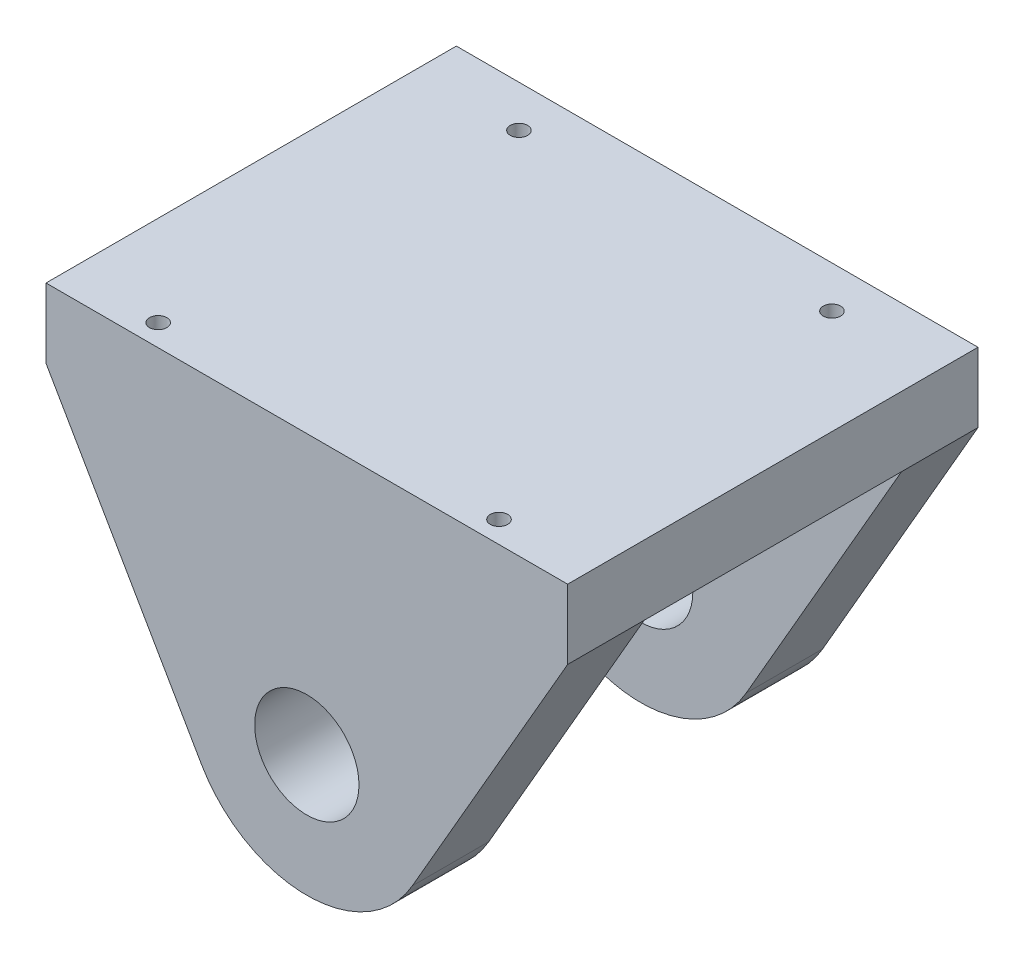
ISO-10303-21;
HEADER;
FILE_DESCRIPTION(('STEP AP214'),'2;1');
FILE_NAME('part.step','',(''),(''),'','','');
FILE_SCHEMA(('AUTOMOTIVE_DESIGN { 1 0 10303 214 1 1 1 1 }'));
ENDSEC;
DATA;
#1=APPLICATION_CONTEXT('core data for automotive mechanical design processes');
#2=APPLICATION_PROTOCOL_DEFINITION('international standard','automotive_design',2000,#1);
#3=PRODUCT_CONTEXT('',#1,'mechanical');
#4=PRODUCT('Part','Part','',(#3));
#5=PRODUCT_RELATED_PRODUCT_CATEGORY('part','',(#4));
#6=PRODUCT_DEFINITION_FORMATION('','',#4);
#7=PRODUCT_DEFINITION_CONTEXT('part definition',#1,'design');
#8=PRODUCT_DEFINITION('design','',#6,#7);
#9=PRODUCT_DEFINITION_SHAPE('','',#8);
#10=(LENGTH_UNIT() NAMED_UNIT(*) SI_UNIT(.MILLI.,.METRE.));
#11=(NAMED_UNIT(*) PLANE_ANGLE_UNIT() SI_UNIT($,.RADIAN.));
#12=(NAMED_UNIT(*) SI_UNIT($,.STERADIAN.) SOLID_ANGLE_UNIT());
#13=UNCERTAINTY_MEASURE_WITH_UNIT(LENGTH_MEASURE(1.E-05),#10,'distance_accuracy_value','');
#14=(GEOMETRIC_REPRESENTATION_CONTEXT(3) GLOBAL_UNCERTAINTY_ASSIGNED_CONTEXT((#13)) GLOBAL_UNIT_ASSIGNED_CONTEXT((#10,
#11,#12)) REPRESENTATION_CONTEXT('',''));
#15=CARTESIAN_POINT('',(0.,0.,0.));
#16=DIRECTION('',(0.,0.,1.));
#17=DIRECTION('',(1.,0.,0.));
#18=AXIS2_PLACEMENT_3D('',#15,#16,#17);
#19=CARTESIAN_POINT('',(0.,30.,-59.));
#20=DIRECTION('',(0.,-1.,0.));
#21=DIRECTION('',(0.,0.,-1.));
#22=AXIS2_PLACEMENT_3D('',#19,#20,#21);
#23=PLANE('',#22);
#24=DIRECTION('',(0.,0.,1.));
#25=VECTOR('',#24,1.);
#26=CARTESIAN_POINT('',(-37.5,30.,-59.));
#27=LINE('',#26,#25);
#28=CARTESIAN_POINT('',(-37.5,30.,-48.));
#29=VERTEX_POINT('',#28);
#30=CARTESIAN_POINT('',(-37.5,30.,-11.));
#31=VERTEX_POINT('',#30);
#32=EDGE_CURVE('E71',#29,#31,#27,.T.);
#33=ORIENTED_EDGE('',*,*,#32,.F.);
#34=DIRECTION('',(1.,0.,0.));
#35=VECTOR('',#34,1.);
#36=CARTESIAN_POINT('',(0.,30.,-48.));
#37=LINE('',#36,#35);
#38=CARTESIAN_POINT('',(37.5,30.,-48.));
#39=VERTEX_POINT('',#38);
#40=EDGE_CURVE('E66',#29,#39,#37,.T.);
#41=ORIENTED_EDGE('',*,*,#40,.T.);
#42=DIRECTION('',(0.,0.,1.));
#43=VECTOR('',#42,1.);
#44=CARTESIAN_POINT('',(37.5,30.,-59.));
#45=LINE('',#44,#43);
#46=CARTESIAN_POINT('',(37.5,30.,-11.));
#47=VERTEX_POINT('',#46);
#48=EDGE_CURVE('E241',#39,#47,#45,.T.);
#49=ORIENTED_EDGE('',*,*,#48,.T.);
#50=DIRECTION('',(1.,0.,0.));
#51=VECTOR('',#50,1.);
#52=CARTESIAN_POINT('',(0.,30.,-11.));
#53=LINE('',#52,#51);
#54=EDGE_CURVE('E265',#31,#47,#53,.T.);
#55=ORIENTED_EDGE('',*,*,#54,.F.);
#56=EDGE_LOOP('',(#33,#41,#49,#55));
#57=FACE_BOUND('',#56,.T.);
#58=ADVANCED_FACE('F48',(#57),#23,.T.);
#59=CARTESIAN_POINT('',(-15.1601468894299,-8.74185027845409,-11.));
#60=DIRECTION('',(0.866294107967425,0.499534301625948,0.));
#61=DIRECTION('',(-0.499534301625948,0.866294107967425,0.));
#62=AXIS2_PLACEMENT_3D('',#59,#60,#61);
#63=PLANE('',#62);
#64=DIRECTION('',(-0.499534301625948,0.866294107967425,0.));
#65=VECTOR('',#64,1.);
#66=CARTESIAN_POINT('',(-15.1601468894299,-8.74185027845409,0.));
#67=LINE('',#66,#65);
#68=CARTESIAN_POINT('',(-15.1601468894299,-8.74185027845409,0.));
#69=VERTEX_POINT('',#68);
#70=CARTESIAN_POINT('',(-37.5,30.,0.));
#71=VERTEX_POINT('',#70);
#72=EDGE_CURVE('E240',#69,#71,#67,.T.);
#73=ORIENTED_EDGE('',*,*,#72,.T.);
#74=DIRECTION('',(0.,0.,1.));
#75=VECTOR('',#74,1.);
#76=CARTESIAN_POINT('',(-37.5,30.,-11.));
#77=LINE('',#76,#75);
#78=EDGE_CURVE('E11',#31,#71,#77,.T.);
#79=ORIENTED_EDGE('',*,*,#78,.F.);
#80=DIRECTION('',(-0.499534301625948,0.866294107967425,0.));
#81=VECTOR('',#80,1.);
#82=CARTESIAN_POINT('',(-15.1601468894299,-8.74185027845409,-11.));
#83=LINE('',#82,#81);
#84=CARTESIAN_POINT('',(-15.1601468894299,-8.74185027845409,-11.));
#85=VERTEX_POINT('',#84);
#86=EDGE_CURVE('E252',#85,#31,#83,.T.);
#87=ORIENTED_EDGE('',*,*,#86,.F.);
#88=DIRECTION('',(0.,0.,1.));
#89=VECTOR('',#88,1.);
#90=CARTESIAN_POINT('',(-15.1601468894299,-8.74185027845409,-11.));
#91=LINE('',#90,#89);
#92=EDGE_CURVE('E52',#85,#69,#91,.T.);
#93=ORIENTED_EDGE('',*,*,#92,.T.);
#94=EDGE_LOOP('',(#73,#79,#87,#93));
#95=FACE_BOUND('',#94,.T.);
#96=ADVANCED_FACE('F50',(#95),#63,.F.);
#97=CARTESIAN_POINT('',(15.1601468894299,-8.74185027845409,-11.));
#98=DIRECTION('',(0.866294107967425,-0.499534301625948,0.));
#99=DIRECTION('',(0.499534301625948,0.866294107967425,0.));
#100=AXIS2_PLACEMENT_3D('',#97,#98,#99);
#101=PLANE('',#100);
#102=DIRECTION('',(0.499534301625948,0.866294107967425,0.));
#103=VECTOR('',#102,1.);
#104=CARTESIAN_POINT('',(15.1601468894299,-8.74185027845409,0.));
#105=LINE('',#104,#103);
#106=CARTESIAN_POINT('',(15.1601468894299,-8.74185027845409,0.));
#107=VERTEX_POINT('',#106);
#108=CARTESIAN_POINT('',(37.5,30.,0.));
#109=VERTEX_POINT('',#108);
#110=EDGE_CURVE('E280',#107,#109,#105,.T.);
#111=ORIENTED_EDGE('',*,*,#110,.F.);
#112=DIRECTION('',(0.,0.,1.));
#113=VECTOR('',#112,1.);
#114=CARTESIAN_POINT('',(15.1601468894299,-8.74185027845409,-11.));
#115=LINE('',#114,#113);
#116=CARTESIAN_POINT('',(15.1601468894299,-8.74185027845409,-11.));
#117=VERTEX_POINT('',#116);
#118=EDGE_CURVE('E289',#117,#107,#115,.T.);
#119=ORIENTED_EDGE('',*,*,#118,.F.);
#120=DIRECTION('',(0.499534301625948,0.866294107967425,0.));
#121=VECTOR('',#120,1.);
#122=CARTESIAN_POINT('',(15.1601468894299,-8.74185027845409,-11.));
#123=LINE('',#122,#121);
#124=EDGE_CURVE('E261',#117,#47,#123,.T.);
#125=ORIENTED_EDGE('',*,*,#124,.T.);
#126=DIRECTION('',(0.,0.,1.));
#127=VECTOR('',#126,1.);
#128=CARTESIAN_POINT('',(37.5,30.,-11.));
#129=LINE('',#128,#127);
#130=EDGE_CURVE('E58',#47,#109,#129,.T.);
#131=ORIENTED_EDGE('',*,*,#130,.T.);
#132=EDGE_LOOP('',(#111,#119,#125,#131));
#133=FACE_BOUND('',#132,.T.);
#134=ADVANCED_FACE('F308',(#133),#101,.T.);
#135=CARTESIAN_POINT('',(0.,0.,-11.));
#136=DIRECTION('',(0.,0.,1.));
#137=DIRECTION('',(1.,0.,0.));
#138=AXIS2_PLACEMENT_3D('',#135,#136,#137);
#139=CYLINDRICAL_SURFACE('',#138,17.5);
#140=CARTESIAN_POINT('',(0.,0.,0.));
#141=DIRECTION('',(0.,0.,1.));
#142=DIRECTION('',(1.,0.,0.));
#143=AXIS2_PLACEMENT_3D('',#140,#141,#142);
#144=CIRCLE('',#143,17.5);
#145=EDGE_CURVE('E276',#69,#107,#144,.T.);
#146=ORIENTED_EDGE('',*,*,#145,.F.);
#147=ORIENTED_EDGE('',*,*,#92,.F.);
#148=CARTESIAN_POINT('',(0.,0.,-11.));
#149=DIRECTION('',(0.,0.,1.));
#150=DIRECTION('',(1.,0.,0.));
#151=AXIS2_PLACEMENT_3D('',#148,#149,#150);
#152=CIRCLE('',#151,17.5);
#153=EDGE_CURVE('E256',#85,#117,#152,.T.);
#154=ORIENTED_EDGE('',*,*,#153,.T.);
#155=ORIENTED_EDGE('',*,*,#118,.T.);
#156=EDGE_LOOP('',(#146,#147,#154,#155));
#157=FACE_BOUND('',#156,.T.);
#158=ADVANCED_FACE('F305',(#157),#139,.T.);
#159=CARTESIAN_POINT('',(0.,0.,-11.));
#160=DIRECTION('',(0.,0.,1.));
#161=DIRECTION('',(1.,0.,0.));
#162=AXIS2_PLACEMENT_3D('',#159,#160,#161);
#163=CYLINDRICAL_SURFACE('',#162,7.5);
#164=CARTESIAN_POINT('',(0.,0.,-11.));
#165=DIRECTION('',(0.,0.,1.));
#166=DIRECTION('',(1.,0.,0.));
#167=AXIS2_PLACEMENT_3D('',#164,#165,#166);
#168=CIRCLE('',#167,7.5);
#169=CARTESIAN_POINT('',(7.5,0.,-11.));
#170=VERTEX_POINT('',#169);
#171=EDGE_CURVE('E269',#170,#170,#168,.T.);
#172=ORIENTED_EDGE('',*,*,#171,.F.);
#173=EDGE_LOOP('',(#172));
#174=FACE_BOUND('',#173,.T.);
#175=CARTESIAN_POINT('',(0.,0.,0.));
#176=DIRECTION('',(0.,0.,1.));
#177=DIRECTION('',(1.,0.,0.));
#178=AXIS2_PLACEMENT_3D('',#175,#176,#177);
#179=CIRCLE('',#178,7.5);
#180=CARTESIAN_POINT('',(7.5,0.,0.));
#181=VERTEX_POINT('',#180);
#182=EDGE_CURVE('E257',#181,#181,#179,.T.);
#183=ORIENTED_EDGE('',*,*,#182,.T.);
#184=EDGE_LOOP('',(#183));
#185=FACE_BOUND('',#184,.T.);
#186=ADVANCED_FACE('F307',(#174,#185),#163,.F.);
#187=CARTESIAN_POINT('',(0.,0.,-11.));
#188=DIRECTION('',(0.,0.,1.));
#189=DIRECTION('',(1.,0.,0.));
#190=AXIS2_PLACEMENT_3D('',#187,#188,#189);
#191=PLANE('',#190);
#192=ORIENTED_EDGE('',*,*,#86,.T.);
#193=ORIENTED_EDGE('',*,*,#54,.T.);
#194=ORIENTED_EDGE('',*,*,#124,.F.);
#195=ORIENTED_EDGE('',*,*,#153,.F.);
#196=EDGE_LOOP('',(#192,#193,#194,#195));
#197=FACE_BOUND('',#196,.T.);
#198=ORIENTED_EDGE('',*,*,#171,.T.);
#199=EDGE_LOOP('',(#198));
#200=FACE_BOUND('',#199,.T.);
#201=ADVANCED_FACE('F312',(#197,#200),#191,.F.);
#202=CARTESIAN_POINT('',(0.,0.,0.));
#203=DIRECTION('',(0.,0.,1.));
#204=DIRECTION('',(1.,0.,0.));
#205=AXIS2_PLACEMENT_3D('',#202,#203,#204);
#206=PLANE('',#205);
#207=ORIENTED_EDGE('',*,*,#72,.F.);
#208=ORIENTED_EDGE('',*,*,#145,.T.);
#209=ORIENTED_EDGE('',*,*,#110,.T.);
#210=DIRECTION('',(0.,-1.,0.));
#211=VECTOR('',#210,1.);
#212=CARTESIAN_POINT('',(37.5,0.,0.));
#213=LINE('',#212,#211);
#214=CARTESIAN_POINT('',(37.5,40.,0.));
#215=VERTEX_POINT('',#214);
#216=EDGE_CURVE('E213',#215,#109,#213,.T.);
#217=ORIENTED_EDGE('',*,*,#216,.F.);
#218=DIRECTION('',(1.,0.,0.));
#219=VECTOR('',#218,1.);
#220=CARTESIAN_POINT('',(0.,40.,0.));
#221=LINE('',#220,#219);
#222=CARTESIAN_POINT('',(-37.5,40.,0.));
#223=VERTEX_POINT('',#222);
#224=EDGE_CURVE('E231',#223,#215,#221,.T.);
#225=ORIENTED_EDGE('',*,*,#224,.F.);
#226=DIRECTION('',(0.,1.,0.));
#227=VECTOR('',#226,1.);
#228=CARTESIAN_POINT('',(-37.5,0.,0.));
#229=LINE('',#228,#227);
#230=EDGE_CURVE('E222',#71,#223,#229,.T.);
#231=ORIENTED_EDGE('',*,*,#230,.F.);
#232=EDGE_LOOP('',(#207,#208,#209,#217,#225,#231));
#233=FACE_BOUND('',#232,.T.);
#234=ORIENTED_EDGE('',*,*,#182,.F.);
#235=EDGE_LOOP('',(#234));
#236=FACE_BOUND('',#235,.T.);
#237=ADVANCED_FACE('F302',(#233,#236),#206,.T.);
#238=CARTESIAN_POINT('',(37.5,0.,-59.));
#239=DIRECTION('',(-1.,0.,0.));
#240=DIRECTION('',(0.,-1.,0.));
#241=AXIS2_PLACEMENT_3D('',#238,#239,#240);
#242=PLANE('',#241);
#243=ORIENTED_EDGE('',*,*,#216,.T.);
#244=ORIENTED_EDGE('',*,*,#130,.F.);
#245=ORIENTED_EDGE('',*,*,#48,.F.);
#246=CARTESIAN_POINT('',(37.5,30.,-59.));
#247=VERTEX_POINT('',#246);
#248=EDGE_CURVE('E236',#247,#39,#45,.T.);
#249=ORIENTED_EDGE('',*,*,#248,.F.);
#250=DIRECTION('',(0.,-1.,0.));
#251=VECTOR('',#250,1.);
#252=CARTESIAN_POINT('',(37.5,0.,-59.));
#253=LINE('',#252,#251);
#254=CARTESIAN_POINT('',(37.5,40.,-59.));
#255=VERTEX_POINT('',#254);
#256=EDGE_CURVE('E217',#255,#247,#253,.T.);
#257=ORIENTED_EDGE('',*,*,#256,.F.);
#258=DIRECTION('',(0.,0.,1.));
#259=VECTOR('',#258,1.);
#260=CARTESIAN_POINT('',(37.5,40.,-59.));
#261=LINE('',#260,#259);
#262=EDGE_CURVE('E228',#255,#215,#261,.T.);
#263=ORIENTED_EDGE('',*,*,#262,.T.);
#264=EDGE_LOOP('',(#243,#244,#245,#249,#257,#263));
#265=FACE_BOUND('',#264,.T.);
#266=ADVANCED_FACE('F333',(#265),#242,.F.);
#267=CARTESIAN_POINT('',(-37.5,0.,-59.));
#268=DIRECTION('',(1.,0.,0.));
#269=DIRECTION('',(0.,0.,-1.));
#270=AXIS2_PLACEMENT_3D('',#267,#268,#269);
#271=PLANE('',#270);
#272=ORIENTED_EDGE('',*,*,#230,.T.);
#273=DIRECTION('',(0.,0.,1.));
#274=VECTOR('',#273,1.);
#275=CARTESIAN_POINT('',(-37.5,40.,-59.));
#276=LINE('',#275,#274);
#277=CARTESIAN_POINT('',(-37.5,40.,-59.));
#278=VERTEX_POINT('',#277);
#279=EDGE_CURVE('E245',#278,#223,#276,.T.);
#280=ORIENTED_EDGE('',*,*,#279,.F.);
#281=DIRECTION('',(0.,1.,0.));
#282=VECTOR('',#281,1.);
#283=CARTESIAN_POINT('',(-37.5,0.,-59.));
#284=LINE('',#283,#282);
#285=CARTESIAN_POINT('',(-37.5,30.,-59.));
#286=VERTEX_POINT('',#285);
#287=EDGE_CURVE('E225',#286,#278,#284,.T.);
#288=ORIENTED_EDGE('',*,*,#287,.F.);
#289=EDGE_CURVE('E242',#286,#29,#27,.T.);
#290=ORIENTED_EDGE('',*,*,#289,.T.);
#291=ORIENTED_EDGE('',*,*,#32,.T.);
#292=ORIENTED_EDGE('',*,*,#78,.T.);
#293=EDGE_LOOP('',(#272,#280,#288,#290,#291,#292));
#294=FACE_BOUND('',#293,.T.);
#295=ADVANCED_FACE('F329',(#294),#271,.F.);
#296=CARTESIAN_POINT('',(0.,40.,-59.));
#297=DIRECTION('',(0.,-1.,0.));
#298=DIRECTION('',(0.,0.,-1.));
#299=AXIS2_PLACEMENT_3D('',#296,#297,#298);
#300=PLANE('',#299);
#301=CARTESIAN_POINT('',(-22.5,40.,-53.));
#302=DIRECTION('',(0.,1.,0.));
#303=DIRECTION('',(0.,0.,1.));
#304=AXIS2_PLACEMENT_3D('',#301,#302,#303);
#305=CIRCLE('',#304,1.24999999999999);
#306=CARTESIAN_POINT('',(-22.5,40.,-51.75));
#307=VERTEX_POINT('',#306);
#308=EDGE_CURVE('E148',#307,#307,#305,.T.);
#309=ORIENTED_EDGE('',*,*,#308,.F.);
#310=EDGE_LOOP('',(#309));
#311=FACE_BOUND('',#310,.T.);
#312=CARTESIAN_POINT('',(22.5,40.,-53.));
#313=DIRECTION('',(0.,1.,0.));
#314=DIRECTION('',(0.,0.,1.));
#315=AXIS2_PLACEMENT_3D('',#312,#313,#314);
#316=CIRCLE('',#315,1.24999999999999);
#317=CARTESIAN_POINT('',(22.5,40.,-51.75));
#318=VERTEX_POINT('',#317);
#319=EDGE_CURVE('E147',#318,#318,#316,.T.);
#320=ORIENTED_EDGE('',*,*,#319,.F.);
#321=EDGE_LOOP('',(#320));
#322=FACE_BOUND('',#321,.T.);
#323=CARTESIAN_POINT('',(-24.5,40.,-3.13));
#324=DIRECTION('',(0.,1.,0.));
#325=DIRECTION('',(0.,0.,1.));
#326=AXIS2_PLACEMENT_3D('',#323,#324,#325);
#327=CIRCLE('',#326,1.24999999999999);
#328=CARTESIAN_POINT('',(-24.5,40.,-1.88000000000001));
#329=VERTEX_POINT('',#328);
#330=EDGE_CURVE('E161',#329,#329,#327,.T.);
#331=ORIENTED_EDGE('',*,*,#330,.F.);
#332=EDGE_LOOP('',(#331));
#333=FACE_BOUND('',#332,.T.);
#334=CARTESIAN_POINT('',(24.5,40.,-3.13));
#335=DIRECTION('',(0.,1.,0.));
#336=DIRECTION('',(0.,0.,1.));
#337=AXIS2_PLACEMENT_3D('',#334,#335,#336);
#338=CIRCLE('',#337,1.24999999999999);
#339=CARTESIAN_POINT('',(24.5,40.,-1.88000000000001));
#340=VERTEX_POINT('',#339);
#341=EDGE_CURVE('E169',#340,#340,#338,.T.);
#342=ORIENTED_EDGE('',*,*,#341,.F.);
#343=EDGE_LOOP('',(#342));
#344=FACE_BOUND('',#343,.T.);
#345=ORIENTED_EDGE('',*,*,#224,.T.);
#346=ORIENTED_EDGE('',*,*,#262,.F.);
#347=DIRECTION('',(1.,0.,0.));
#348=VECTOR('',#347,1.);
#349=CARTESIAN_POINT('',(0.,40.,-59.));
#350=LINE('',#349,#348);
#351=EDGE_CURVE('E221',#278,#255,#350,.T.);
#352=ORIENTED_EDGE('',*,*,#351,.F.);
#353=ORIENTED_EDGE('',*,*,#279,.T.);
#354=EDGE_LOOP('',(#345,#346,#352,#353));
#355=FACE_BOUND('',#354,.T.);
#356=ADVANCED_FACE('F332',(#311,#322,#333,#344,#355),#300,.F.);
#357=CARTESIAN_POINT('',(0.,0.,-59.));
#358=DIRECTION('',(0.,0.,1.));
#359=DIRECTION('',(1.,0.,0.));
#360=AXIS2_PLACEMENT_3D('',#357,#358,#359);
#361=PLANE('',#360);
#362=ORIENTED_EDGE('',*,*,#256,.T.);
#363=DIRECTION('',(0.499534301625948,0.866294107967425,0.));
#364=VECTOR('',#363,1.);
#365=CARTESIAN_POINT('',(15.1601468894299,-8.74185027845409,-59.));
#366=LINE('',#365,#364);
#367=CARTESIAN_POINT('',(15.1601468894299,-8.74185027845409,-59.));
#368=VERTEX_POINT('',#367);
#369=EDGE_CURVE('E200',#368,#247,#366,.T.);
#370=ORIENTED_EDGE('',*,*,#369,.F.);
#371=CARTESIAN_POINT('',(0.,0.,-59.));
#372=DIRECTION('',(0.,0.,1.));
#373=DIRECTION('',(1.,0.,0.));
#374=AXIS2_PLACEMENT_3D('',#371,#372,#373);
#375=CIRCLE('',#374,17.5);
#376=CARTESIAN_POINT('',(-15.1601468894299,-8.74185027845409,-59.));
#377=VERTEX_POINT('',#376);
#378=EDGE_CURVE('E204',#377,#368,#375,.T.);
#379=ORIENTED_EDGE('',*,*,#378,.F.);
#380=DIRECTION('',(-0.499534301625948,0.866294107967425,0.));
#381=VECTOR('',#380,1.);
#382=CARTESIAN_POINT('',(-15.1601468894299,-8.74185027845409,-59.));
#383=LINE('',#382,#381);
#384=EDGE_CURVE('E177',#377,#286,#383,.T.);
#385=ORIENTED_EDGE('',*,*,#384,.T.);
#386=ORIENTED_EDGE('',*,*,#287,.T.);
#387=ORIENTED_EDGE('',*,*,#351,.T.);
#388=EDGE_LOOP('',(#362,#370,#379,#385,#386,#387));
#389=FACE_BOUND('',#388,.T.);
#390=CARTESIAN_POINT('',(0.,0.,-59.));
#391=DIRECTION('',(0.,0.,1.));
#392=DIRECTION('',(1.,0.,0.));
#393=AXIS2_PLACEMENT_3D('',#390,#391,#392);
#394=CIRCLE('',#393,7.5);
#395=CARTESIAN_POINT('',(7.5,0.,-59.));
#396=VERTEX_POINT('',#395);
#397=EDGE_CURVE('E182',#396,#396,#394,.T.);
#398=ORIENTED_EDGE('',*,*,#397,.T.);
#399=EDGE_LOOP('',(#398));
#400=FACE_BOUND('',#399,.T.);
#401=ADVANCED_FACE('F327',(#389,#400),#361,.F.);
#402=CARTESIAN_POINT('',(-15.1601468894299,-8.74185027845409,-48.));
#403=DIRECTION('',(-0.866294107967425,-0.499534301625948,0.));
#404=DIRECTION('',(0.499534301625948,-0.866294107967425,0.));
#405=AXIS2_PLACEMENT_3D('',#402,#403,#404);
#406=PLANE('',#405);
#407=ORIENTED_EDGE('',*,*,#384,.F.);
#408=DIRECTION('',(0.,0.,-1.));
#409=VECTOR('',#408,1.);
#410=CARTESIAN_POINT('',(-15.1601468894299,-8.74185027845409,-48.));
#411=LINE('',#410,#409);
#412=CARTESIAN_POINT('',(-15.1601468894299,-8.74185027845409,-48.));
#413=VERTEX_POINT('',#412);
#414=EDGE_CURVE('E210',#413,#377,#411,.T.);
#415=ORIENTED_EDGE('',*,*,#414,.F.);
#416=DIRECTION('',(-0.499534301625948,0.866294107967425,0.));
#417=VECTOR('',#416,1.);
#418=CARTESIAN_POINT('',(-15.1601468894299,-8.74185027845409,-48.));
#419=LINE('',#418,#417);
#420=EDGE_CURVE('E178',#413,#29,#419,.T.);
#421=ORIENTED_EDGE('',*,*,#420,.T.);
#422=ORIENTED_EDGE('',*,*,#289,.F.);
#423=EDGE_LOOP('',(#407,#415,#421,#422));
#424=FACE_BOUND('',#423,.T.);
#425=ADVANCED_FACE('F400',(#424),#406,.T.);
#426=CARTESIAN_POINT('',(0.,0.,-48.));
#427=DIRECTION('',(0.,0.,-1.));
#428=DIRECTION('',(-1.,0.,0.));
#429=AXIS2_PLACEMENT_3D('',#426,#427,#428);
#430=CYLINDRICAL_SURFACE('',#429,17.5);
#431=ORIENTED_EDGE('',*,*,#378,.T.);
#432=DIRECTION('',(0.,0.,-1.));
#433=VECTOR('',#432,1.);
#434=CARTESIAN_POINT('',(15.1601468894299,-8.74185027845409,-48.));
#435=LINE('',#434,#433);
#436=CARTESIAN_POINT('',(15.1601468894299,-8.74185027845409,-48.));
#437=VERTEX_POINT('',#436);
#438=EDGE_CURVE('E196',#437,#368,#435,.T.);
#439=ORIENTED_EDGE('',*,*,#438,.F.);
#440=CARTESIAN_POINT('',(0.,0.,-48.));
#441=DIRECTION('',(0.,0.,1.));
#442=DIRECTION('',(1.,0.,0.));
#443=AXIS2_PLACEMENT_3D('',#440,#441,#442);
#444=CIRCLE('',#443,17.5);
#445=EDGE_CURVE('E189',#413,#437,#444,.T.);
#446=ORIENTED_EDGE('',*,*,#445,.F.);
#447=ORIENTED_EDGE('',*,*,#414,.T.);
#448=EDGE_LOOP('',(#431,#439,#446,#447));
#449=FACE_BOUND('',#448,.T.);
#450=ADVANCED_FACE('F414',(#449),#430,.T.);
#451=CARTESIAN_POINT('',(15.1601468894299,-8.74185027845409,-48.));
#452=DIRECTION('',(-0.866294107967425,0.499534301625948,0.));
#453=DIRECTION('',(-0.499534301625948,-0.866294107967425,0.));
#454=AXIS2_PLACEMENT_3D('',#451,#452,#453);
#455=PLANE('',#454);
#456=ORIENTED_EDGE('',*,*,#369,.T.);
#457=ORIENTED_EDGE('',*,*,#248,.T.);
#458=DIRECTION('',(0.499534301625948,0.866294107967425,0.));
#459=VECTOR('',#458,1.);
#460=CARTESIAN_POINT('',(15.1601468894299,-8.74185027845409,-48.));
#461=LINE('',#460,#459);
#462=EDGE_CURVE('E185',#437,#39,#461,.T.);
#463=ORIENTED_EDGE('',*,*,#462,.F.);
#464=ORIENTED_EDGE('',*,*,#438,.T.);
#465=EDGE_LOOP('',(#456,#457,#463,#464));
#466=FACE_BOUND('',#465,.T.);
#467=ADVANCED_FACE('F423',(#466),#455,.F.);
#468=CARTESIAN_POINT('',(0.,0.,-48.));
#469=DIRECTION('',(0.,0.,-1.));
#470=DIRECTION('',(-1.,0.,0.));
#471=AXIS2_PLACEMENT_3D('',#468,#469,#470);
#472=CYLINDRICAL_SURFACE('',#471,7.5);
#473=CARTESIAN_POINT('',(0.,0.,-48.));
#474=DIRECTION('',(0.,0.,1.));
#475=DIRECTION('',(1.,0.,0.));
#476=AXIS2_PLACEMENT_3D('',#473,#474,#475);
#477=CIRCLE('',#476,7.5);
#478=CARTESIAN_POINT('',(7.5,0.,-48.));
#479=VERTEX_POINT('',#478);
#480=EDGE_CURVE('E192',#479,#479,#477,.T.);
#481=ORIENTED_EDGE('',*,*,#480,.T.);
#482=EDGE_LOOP('',(#481));
#483=FACE_BOUND('',#482,.T.);
#484=ORIENTED_EDGE('',*,*,#397,.F.);
#485=EDGE_LOOP('',(#484));
#486=FACE_BOUND('',#485,.T.);
#487=ADVANCED_FACE('F432',(#483,#486),#472,.F.);
#488=CARTESIAN_POINT('',(0.,0.,-48.));
#489=DIRECTION('',(0.,0.,-1.));
#490=DIRECTION('',(1.,0.,0.));
#491=AXIS2_PLACEMENT_3D('',#488,#489,#490);
#492=PLANE('',#491);
#493=ORIENTED_EDGE('',*,*,#420,.F.);
#494=ORIENTED_EDGE('',*,*,#445,.T.);
#495=ORIENTED_EDGE('',*,*,#462,.T.);
#496=ORIENTED_EDGE('',*,*,#40,.F.);
#497=EDGE_LOOP('',(#493,#494,#495,#496));
#498=FACE_BOUND('',#497,.T.);
#499=ORIENTED_EDGE('',*,*,#480,.F.);
#500=EDGE_LOOP('',(#499));
#501=FACE_BOUND('',#500,.T.);
#502=ADVANCED_FACE('F441',(#498,#501),#492,.F.);
#503=CARTESIAN_POINT('',(24.5,32.,-3.13));
#504=DIRECTION('',(0.,1.,0.));
#505=DIRECTION('',(0.,0.,1.));
#506=AXIS2_PLACEMENT_3D('',#503,#504,#505);
#507=CONICAL_SURFACE('',#506,1.25,1.02974425867665);
#508=CARTESIAN_POINT('',(24.5,31.2489242262155,-3.13));
#509=VERTEX_POINT('',#508);
#510=VERTEX_LOOP('',#509);
#511=FACE_BOUND('',#510,.T.);
#512=CARTESIAN_POINT('',(24.5,32.,-3.13));
#513=DIRECTION('',(0.,1.,0.));
#514=DIRECTION('',(0.,0.,1.));
#515=AXIS2_PLACEMENT_3D('',#512,#513,#514);
#516=CIRCLE('',#515,1.25);
#517=CARTESIAN_POINT('',(24.5,32.,-1.88));
#518=VERTEX_POINT('',#517);
#519=EDGE_CURVE('E173',#518,#518,#516,.T.);
#520=ORIENTED_EDGE('',*,*,#519,.T.);
#521=EDGE_LOOP('',(#520));
#522=FACE_BOUND('',#521,.T.);
#523=ADVANCED_FACE('F450',(#511,#522),#507,.F.);
#524=CARTESIAN_POINT('',(24.5,40.,-3.13));
#525=DIRECTION('',(0.,1.,0.));
#526=DIRECTION('',(0.,0.,1.));
#527=AXIS2_PLACEMENT_3D('',#524,#525,#526);
#528=CYLINDRICAL_SURFACE('',#527,1.24999999999999);
#529=ORIENTED_EDGE('',*,*,#519,.F.);
#530=EDGE_LOOP('',(#529));
#531=FACE_BOUND('',#530,.T.);
#532=ORIENTED_EDGE('',*,*,#341,.T.);
#533=EDGE_LOOP('',(#532));
#534=FACE_BOUND('',#533,.T.);
#535=ADVANCED_FACE('F460',(#531,#534),#528,.F.);
#536=CARTESIAN_POINT('',(-24.5,32.,-3.13));
#537=DIRECTION('',(0.,1.,0.));
#538=DIRECTION('',(0.,0.,1.));
#539=AXIS2_PLACEMENT_3D('',#536,#537,#538);
#540=CONICAL_SURFACE('',#539,1.25,1.02974425867665);
#541=CARTESIAN_POINT('',(-24.5,31.2489242262155,-3.13));
#542=VERTEX_POINT('',#541);
#543=VERTEX_LOOP('',#542);
#544=FACE_BOUND('',#543,.T.);
#545=CARTESIAN_POINT('',(-24.5,32.,-3.13));
#546=DIRECTION('',(0.,1.,0.));
#547=DIRECTION('',(0.,0.,1.));
#548=AXIS2_PLACEMENT_3D('',#545,#546,#547);
#549=CIRCLE('',#548,1.25);
#550=CARTESIAN_POINT('',(-24.5,32.,-1.88));
#551=VERTEX_POINT('',#550);
#552=EDGE_CURVE('E165',#551,#551,#549,.T.);
#553=ORIENTED_EDGE('',*,*,#552,.T.);
#554=EDGE_LOOP('',(#553));
#555=FACE_BOUND('',#554,.T.);
#556=ADVANCED_FACE('F469',(#544,#555),#540,.F.);
#557=CARTESIAN_POINT('',(-24.5,40.,-3.13));
#558=DIRECTION('',(0.,1.,0.));
#559=DIRECTION('',(0.,0.,1.));
#560=AXIS2_PLACEMENT_3D('',#557,#558,#559);
#561=CYLINDRICAL_SURFACE('',#560,1.24999999999999);
#562=ORIENTED_EDGE('',*,*,#552,.F.);
#563=EDGE_LOOP('',(#562));
#564=FACE_BOUND('',#563,.T.);
#565=ORIENTED_EDGE('',*,*,#330,.T.);
#566=EDGE_LOOP('',(#565));
#567=FACE_BOUND('',#566,.T.);
#568=ADVANCED_FACE('F478',(#564,#567),#561,.F.);
#569=CARTESIAN_POINT('',(22.5,32.,-53.));
#570=DIRECTION('',(0.,1.,0.));
#571=DIRECTION('',(0.,0.,1.));
#572=AXIS2_PLACEMENT_3D('',#569,#570,#571);
#573=CONICAL_SURFACE('',#572,1.25,1.02974425867665);
#574=CARTESIAN_POINT('',(22.5,31.2489242262155,-53.));
#575=VERTEX_POINT('',#574);
#576=VERTEX_LOOP('',#575);
#577=FACE_BOUND('',#576,.T.);
#578=CARTESIAN_POINT('',(22.5,32.,-53.));
#579=DIRECTION('',(0.,1.,0.));
#580=DIRECTION('',(0.,0.,1.));
#581=AXIS2_PLACEMENT_3D('',#578,#579,#580);
#582=CIRCLE('',#581,1.25);
#583=CARTESIAN_POINT('',(22.5,32.,-51.75));
#584=VERTEX_POINT('',#583);
#585=EDGE_CURVE('E153',#584,#584,#582,.T.);
#586=ORIENTED_EDGE('',*,*,#585,.T.);
#587=EDGE_LOOP('',(#586));
#588=FACE_BOUND('',#587,.T.);
#589=ADVANCED_FACE('F487',(#577,#588),#573,.F.);
#590=CARTESIAN_POINT('',(22.5,40.,-53.));
#591=DIRECTION('',(0.,1.,0.));
#592=DIRECTION('',(0.,0.,1.));
#593=AXIS2_PLACEMENT_3D('',#590,#591,#592);
#594=CYLINDRICAL_SURFACE('',#593,1.24999999999999);
#595=ORIENTED_EDGE('',*,*,#585,.F.);
#596=EDGE_LOOP('',(#595));
#597=FACE_BOUND('',#596,.T.);
#598=ORIENTED_EDGE('',*,*,#319,.T.);
#599=EDGE_LOOP('',(#598));
#600=FACE_BOUND('',#599,.T.);
#601=ADVANCED_FACE('F140',(#597,#600),#594,.F.);
#602=CARTESIAN_POINT('',(-22.5,32.,-53.));
#603=DIRECTION('',(0.,1.,0.));
#604=DIRECTION('',(0.,0.,1.));
#605=AXIS2_PLACEMENT_3D('',#602,#603,#604);
#606=CONICAL_SURFACE('',#605,1.25,1.02974425867665);
#607=CARTESIAN_POINT('',(-22.5,31.2489242262155,-53.));
#608=VERTEX_POINT('',#607);
#609=VERTEX_LOOP('',#608);
#610=FACE_BOUND('',#609,.T.);
#611=CARTESIAN_POINT('',(-22.5,32.,-53.));
#612=DIRECTION('',(0.,1.,0.));
#613=DIRECTION('',(0.,0.,1.));
#614=AXIS2_PLACEMENT_3D('',#611,#612,#613);
#615=CIRCLE('',#614,1.25);
#616=CARTESIAN_POINT('',(-22.5,32.,-51.75));
#617=VERTEX_POINT('',#616);
#618=EDGE_CURVE('E144',#617,#617,#615,.T.);
#619=ORIENTED_EDGE('',*,*,#618,.T.);
#620=EDGE_LOOP('',(#619));
#621=FACE_BOUND('',#620,.T.);
#622=ADVANCED_FACE('F136',(#610,#621),#606,.F.);
#623=CARTESIAN_POINT('',(-22.5,40.,-53.));
#624=DIRECTION('',(0.,1.,0.));
#625=DIRECTION('',(0.,0.,1.));
#626=AXIS2_PLACEMENT_3D('',#623,#624,#625);
#627=CYLINDRICAL_SURFACE('',#626,1.24999999999999);
#628=ORIENTED_EDGE('',*,*,#618,.F.);
#629=EDGE_LOOP('',(#628));
#630=FACE_BOUND('',#629,.T.);
#631=ORIENTED_EDGE('',*,*,#308,.T.);
#632=EDGE_LOOP('',(#631));
#633=FACE_BOUND('',#632,.T.);
#634=ADVANCED_FACE('F139',(#630,#633),#627,.F.);
#635=CLOSED_SHELL('',(#58,#96,#134,#158,#186,#201,#237,#266,#295,#356,#401,#425,#450,#467,#487,
#502,#523,#535,#556,#568,#589,#601,#622,#634));
#636=MANIFOLD_SOLID_BREP('B2',#635);
#637=ADVANCED_BREP_SHAPE_REPRESENTATION('',(#18,#636),#14);
#638=SHAPE_DEFINITION_REPRESENTATION(#9,#637);
ENDSEC;
END-ISO-10303-21;
